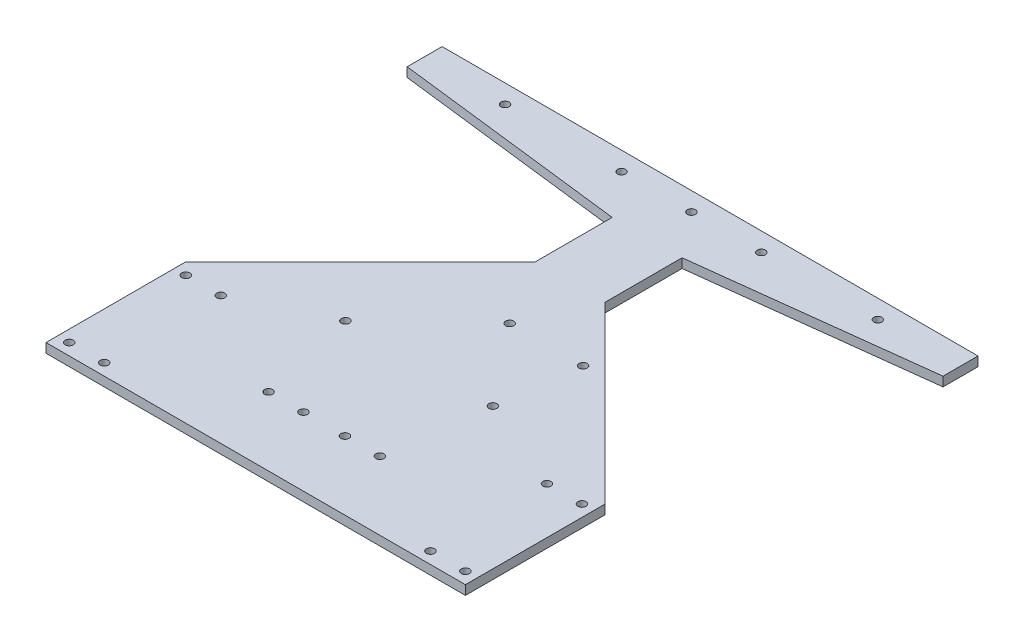
ISO-10303-21;
HEADER;
FILE_DESCRIPTION(('STEP AP214'),'2;1');
FILE_NAME('part.step','',(''),(''),'','','');
FILE_SCHEMA(('AUTOMOTIVE_DESIGN { 1 0 10303 214 1 1 1 1 }'));
ENDSEC;
DATA;
#1=APPLICATION_CONTEXT('core data for automotive mechanical design processes');
#2=APPLICATION_PROTOCOL_DEFINITION('international standard','automotive_design',2000,#1);
#3=PRODUCT_CONTEXT('',#1,'mechanical');
#4=PRODUCT('Part','Part','',(#3));
#5=PRODUCT_RELATED_PRODUCT_CATEGORY('part','',(#4));
#6=PRODUCT_DEFINITION_FORMATION('','',#4);
#7=PRODUCT_DEFINITION_CONTEXT('part definition',#1,'design');
#8=PRODUCT_DEFINITION('design','',#6,#7);
#9=PRODUCT_DEFINITION_SHAPE('','',#8);
#10=(LENGTH_UNIT() NAMED_UNIT(*) SI_UNIT(.MILLI.,.METRE.));
#11=(NAMED_UNIT(*) PLANE_ANGLE_UNIT() SI_UNIT($,.RADIAN.));
#12=(NAMED_UNIT(*) SI_UNIT($,.STERADIAN.) SOLID_ANGLE_UNIT());
#13=UNCERTAINTY_MEASURE_WITH_UNIT(LENGTH_MEASURE(1.E-05),#10,'distance_accuracy_value','');
#14=(GEOMETRIC_REPRESENTATION_CONTEXT(3) GLOBAL_UNCERTAINTY_ASSIGNED_CONTEXT((#13)) GLOBAL_UNIT_ASSIGNED_CONTEXT((#10,
#11,#12)) REPRESENTATION_CONTEXT('',''));
#15=CARTESIAN_POINT('',(0.,0.,0.));
#16=DIRECTION('',(0.,0.,1.));
#17=DIRECTION('',(1.,0.,0.));
#18=AXIS2_PLACEMENT_3D('',#15,#16,#17);
#19=CARTESIAN_POINT('',(90.,4.,-30.));
#20=DIRECTION('',(-1.,0.,0.));
#21=DIRECTION('',(0.,0.,1.));
#22=AXIS2_PLACEMENT_3D('',#19,#20,#21);
#23=PLANE('',#22);
#24=DIRECTION('',(0.,0.,-1.));
#25=VECTOR('',#24,1.);
#26=CARTESIAN_POINT('',(90.,0.,-30.));
#27=LINE('',#26,#25);
#28=CARTESIAN_POINT('',(90.,0.,30.));
#29=VERTEX_POINT('',#28);
#30=CARTESIAN_POINT('',(90.,0.,-30.));
#31=VERTEX_POINT('',#30);
#32=EDGE_CURVE('E167',#29,#31,#27,.T.);
#33=ORIENTED_EDGE('',*,*,#32,.T.);
#34=DIRECTION('',(0.,-1.,0.));
#35=VECTOR('',#34,1.);
#36=CARTESIAN_POINT('',(90.,4.,-30.));
#37=LINE('',#36,#35);
#38=CARTESIAN_POINT('',(90.,4.,-30.));
#39=VERTEX_POINT('',#38);
#40=EDGE_CURVE('E11',#39,#31,#37,.T.);
#41=ORIENTED_EDGE('',*,*,#40,.F.);
#42=DIRECTION('',(0.,0.,-1.));
#43=VECTOR('',#42,1.);
#44=CARTESIAN_POINT('',(90.,4.,-30.));
#45=LINE('',#44,#43);
#46=CARTESIAN_POINT('',(90.,4.,30.));
#47=VERTEX_POINT('',#46);
#48=EDGE_CURVE('E202',#47,#39,#45,.T.);
#49=ORIENTED_EDGE('',*,*,#48,.F.);
#50=DIRECTION('',(0.,-1.,0.));
#51=VECTOR('',#50,1.);
#52=CARTESIAN_POINT('',(90.,4.,30.));
#53=LINE('',#52,#51);
#54=EDGE_CURVE('E163',#47,#29,#53,.T.);
#55=ORIENTED_EDGE('',*,*,#54,.T.);
#56=EDGE_LOOP('',(#33,#41,#49,#55));
#57=FACE_BOUND('',#56,.T.);
#58=ADVANCED_FACE('F42',(#57),#23,.F.);
#59=CARTESIAN_POINT('',(90.,4.,-30.));
#60=DIRECTION('',(-0.707106781186548,0.,0.707106781186547));
#61=DIRECTION('',(0.707106781186547,0.,0.707106781186548));
#62=AXIS2_PLACEMENT_3D('',#59,#60,#61);
#63=PLANE('',#62);
#64=DIRECTION('',(-0.707106781186547,0.,-0.707106781186548));
#65=VECTOR('',#64,1.);
#66=CARTESIAN_POINT('',(90.,0.,-30.));
#67=LINE('',#66,#65);
#68=CARTESIAN_POINT('',(15.,0.,-105.));
#69=VERTEX_POINT('',#68);
#70=EDGE_CURVE('E171',#31,#69,#67,.T.);
#71=ORIENTED_EDGE('',*,*,#70,.T.);
#72=DIRECTION('',(0.,-1.,0.));
#73=VECTOR('',#72,1.);
#74=CARTESIAN_POINT('',(15.,4.,-105.));
#75=LINE('',#74,#73);
#76=CARTESIAN_POINT('',(15.,4.,-105.));
#77=VERTEX_POINT('',#76);
#78=EDGE_CURVE('E51',#77,#69,#75,.T.);
#79=ORIENTED_EDGE('',*,*,#78,.F.);
#80=DIRECTION('',(-0.707106781186547,0.,-0.707106781186548));
#81=VECTOR('',#80,1.);
#82=CARTESIAN_POINT('',(90.,4.,-30.));
#83=LINE('',#82,#81);
#84=EDGE_CURVE('E114',#39,#77,#83,.T.);
#85=ORIENTED_EDGE('',*,*,#84,.F.);
#86=ORIENTED_EDGE('',*,*,#40,.T.);
#87=EDGE_LOOP('',(#71,#79,#85,#86));
#88=FACE_BOUND('',#87,.T.);
#89=ADVANCED_FACE('F298',(#88),#63,.F.);
#90=CARTESIAN_POINT('',(15.,4.,-105.));
#91=DIRECTION('',(-1.,0.,0.));
#92=DIRECTION('',(0.,0.,1.));
#93=AXIS2_PLACEMENT_3D('',#90,#91,#92);
#94=PLANE('',#93);
#95=DIRECTION('',(0.,0.,-1.));
#96=VECTOR('',#95,1.);
#97=CARTESIAN_POINT('',(15.,0.,-105.));
#98=LINE('',#97,#96);
#99=CARTESIAN_POINT('',(15.,0.,-138.));
#100=VERTEX_POINT('',#99);
#101=EDGE_CURVE('E175',#69,#100,#98,.T.);
#102=ORIENTED_EDGE('',*,*,#101,.T.);
#103=DIRECTION('',(0.,-1.,0.));
#104=VECTOR('',#103,1.);
#105=CARTESIAN_POINT('',(15.,4.,-138.));
#106=LINE('',#105,#104);
#107=CARTESIAN_POINT('',(15.,4.,-138.));
#108=VERTEX_POINT('',#107);
#109=EDGE_CURVE('E229',#108,#100,#106,.T.);
#110=ORIENTED_EDGE('',*,*,#109,.F.);
#111=DIRECTION('',(0.,0.,-1.));
#112=VECTOR('',#111,1.);
#113=CARTESIAN_POINT('',(15.,4.,-105.));
#114=LINE('',#113,#112);
#115=EDGE_CURVE('E239',#77,#108,#114,.T.);
#116=ORIENTED_EDGE('',*,*,#115,.F.);
#117=ORIENTED_EDGE('',*,*,#78,.T.);
#118=EDGE_LOOP('',(#102,#110,#116,#117));
#119=FACE_BOUND('',#118,.T.);
#120=ADVANCED_FACE('F237',(#119),#94,.F.);
#121=CARTESIAN_POINT('',(15.,4.,-138.));
#122=DIRECTION('',(-0.11914522061843,0.,-0.992876838486922));
#123=DIRECTION('',(-0.992876838486922,0.,0.11914522061843));
#124=AXIS2_PLACEMENT_3D('',#121,#122,#123);
#125=PLANE('',#124);
#126=DIRECTION('',(0.992876838486922,0.,-0.11914522061843));
#127=VECTOR('',#126,1.);
#128=CARTESIAN_POINT('',(15.,0.,-138.));
#129=LINE('',#128,#127);
#130=CARTESIAN_POINT('',(115.,0.,-150.));
#131=VERTEX_POINT('',#130);
#132=EDGE_CURVE('E178',#100,#131,#129,.T.);
#133=ORIENTED_EDGE('',*,*,#132,.T.);
#134=DIRECTION('',(0.,-1.,0.));
#135=VECTOR('',#134,1.);
#136=CARTESIAN_POINT('',(115.,4.,-150.));
#137=LINE('',#136,#135);
#138=CARTESIAN_POINT('',(115.,4.,-150.));
#139=VERTEX_POINT('',#138);
#140=EDGE_CURVE('E225',#139,#131,#137,.T.);
#141=ORIENTED_EDGE('',*,*,#140,.F.);
#142=DIRECTION('',(0.992876838486922,0.,-0.11914522061843));
#143=VECTOR('',#142,1.);
#144=CARTESIAN_POINT('',(15.,4.,-138.));
#145=LINE('',#144,#143);
#146=EDGE_CURVE('E258',#108,#139,#145,.T.);
#147=ORIENTED_EDGE('',*,*,#146,.F.);
#148=ORIENTED_EDGE('',*,*,#109,.T.);
#149=EDGE_LOOP('',(#133,#141,#147,#148));
#150=FACE_BOUND('',#149,.T.);
#151=ADVANCED_FACE('F248',(#150),#125,.F.);
#152=CARTESIAN_POINT('',(115.,4.,-150.));
#153=DIRECTION('',(-1.,0.,0.));
#154=DIRECTION('',(0.,0.,1.));
#155=AXIS2_PLACEMENT_3D('',#152,#153,#154);
#156=PLANE('',#155);
#157=DIRECTION('',(0.,0.,-1.));
#158=VECTOR('',#157,1.);
#159=CARTESIAN_POINT('',(115.,0.,-150.));
#160=LINE('',#159,#158);
#161=CARTESIAN_POINT('',(115.,0.,-165.));
#162=VERTEX_POINT('',#161);
#163=EDGE_CURVE('E181',#131,#162,#160,.T.);
#164=ORIENTED_EDGE('',*,*,#163,.T.);
#165=DIRECTION('',(0.,-1.,0.));
#166=VECTOR('',#165,1.);
#167=CARTESIAN_POINT('',(115.,4.,-165.));
#168=LINE('',#167,#166);
#169=CARTESIAN_POINT('',(115.,4.,-165.));
#170=VERTEX_POINT('',#169);
#171=EDGE_CURVE('E221',#170,#162,#168,.T.);
#172=ORIENTED_EDGE('',*,*,#171,.F.);
#173=DIRECTION('',(0.,0.,-1.));
#174=VECTOR('',#173,1.);
#175=CARTESIAN_POINT('',(115.,4.,-150.));
#176=LINE('',#175,#174);
#177=EDGE_CURVE('E254',#139,#170,#176,.T.);
#178=ORIENTED_EDGE('',*,*,#177,.F.);
#179=ORIENTED_EDGE('',*,*,#140,.T.);
#180=EDGE_LOOP('',(#164,#172,#178,#179));
#181=FACE_BOUND('',#180,.T.);
#182=ADVANCED_FACE('F252',(#181),#156,.F.);
#183=CARTESIAN_POINT('',(115.,4.,-165.));
#184=DIRECTION('',(0.,0.,1.));
#185=DIRECTION('',(1.,0.,0.));
#186=AXIS2_PLACEMENT_3D('',#183,#184,#185);
#187=PLANE('',#186);
#188=DIRECTION('',(-1.,0.,0.));
#189=VECTOR('',#188,1.);
#190=CARTESIAN_POINT('',(115.,0.,-165.));
#191=LINE('',#190,#189);
#192=CARTESIAN_POINT('',(-115.,0.,-165.));
#193=VERTEX_POINT('',#192);
#194=EDGE_CURVE('E184',#162,#193,#191,.T.);
#195=ORIENTED_EDGE('',*,*,#194,.T.);
#196=DIRECTION('',(0.,-1.,0.));
#197=VECTOR('',#196,1.);
#198=CARTESIAN_POINT('',(-115.,4.,-165.));
#199=LINE('',#198,#197);
#200=CARTESIAN_POINT('',(-115.,4.,-165.));
#201=VERTEX_POINT('',#200);
#202=EDGE_CURVE('E217',#201,#193,#199,.T.);
#203=ORIENTED_EDGE('',*,*,#202,.F.);
#204=DIRECTION('',(-1.,0.,0.));
#205=VECTOR('',#204,1.);
#206=CARTESIAN_POINT('',(115.,4.,-165.));
#207=LINE('',#206,#205);
#208=EDGE_CURVE('E257',#170,#201,#207,.T.);
#209=ORIENTED_EDGE('',*,*,#208,.F.);
#210=ORIENTED_EDGE('',*,*,#171,.T.);
#211=EDGE_LOOP('',(#195,#203,#209,#210));
#212=FACE_BOUND('',#211,.T.);
#213=ADVANCED_FACE('F311',(#212),#187,.F.);
#214=CARTESIAN_POINT('',(-115.,4.,-165.));
#215=DIRECTION('',(1.,0.,0.));
#216=DIRECTION('',(0.,0.,-1.));
#217=AXIS2_PLACEMENT_3D('',#214,#215,#216);
#218=PLANE('',#217);
#219=DIRECTION('',(0.,0.,1.));
#220=VECTOR('',#219,1.);
#221=CARTESIAN_POINT('',(-115.,0.,-165.));
#222=LINE('',#221,#220);
#223=CARTESIAN_POINT('',(-115.,0.,-150.));
#224=VERTEX_POINT('',#223);
#225=EDGE_CURVE('E187',#193,#224,#222,.T.);
#226=ORIENTED_EDGE('',*,*,#225,.T.);
#227=DIRECTION('',(0.,-1.,0.));
#228=VECTOR('',#227,1.);
#229=CARTESIAN_POINT('',(-115.,4.,-150.));
#230=LINE('',#229,#228);
#231=CARTESIAN_POINT('',(-115.,4.,-150.));
#232=VERTEX_POINT('',#231);
#233=EDGE_CURVE('E213',#232,#224,#230,.T.);
#234=ORIENTED_EDGE('',*,*,#233,.F.);
#235=DIRECTION('',(0.,0.,1.));
#236=VECTOR('',#235,1.);
#237=CARTESIAN_POINT('',(-115.,4.,-165.));
#238=LINE('',#237,#236);
#239=EDGE_CURVE('E262',#201,#232,#238,.T.);
#240=ORIENTED_EDGE('',*,*,#239,.F.);
#241=ORIENTED_EDGE('',*,*,#202,.T.);
#242=EDGE_LOOP('',(#226,#234,#240,#241));
#243=FACE_BOUND('',#242,.T.);
#244=ADVANCED_FACE('F314',(#243),#218,.F.);
#245=CARTESIAN_POINT('',(-115.,4.,-150.));
#246=DIRECTION('',(0.11914522061843,0.,-0.992876838486922));
#247=DIRECTION('',(-0.992876838486922,0.,-0.11914522061843));
#248=AXIS2_PLACEMENT_3D('',#245,#246,#247);
#249=PLANE('',#248);
#250=DIRECTION('',(0.992876838486922,0.,0.11914522061843));
#251=VECTOR('',#250,1.);
#252=CARTESIAN_POINT('',(-115.,0.,-150.));
#253=LINE('',#252,#251);
#254=CARTESIAN_POINT('',(-15.,0.,-138.));
#255=VERTEX_POINT('',#254);
#256=EDGE_CURVE('E190',#224,#255,#253,.T.);
#257=ORIENTED_EDGE('',*,*,#256,.T.);
#258=DIRECTION('',(0.,-1.,0.));
#259=VECTOR('',#258,1.);
#260=CARTESIAN_POINT('',(-15.,4.,-138.));
#261=LINE('',#260,#259);
#262=CARTESIAN_POINT('',(-15.,4.,-138.));
#263=VERTEX_POINT('',#262);
#264=EDGE_CURVE('E209',#263,#255,#261,.T.);
#265=ORIENTED_EDGE('',*,*,#264,.F.);
#266=DIRECTION('',(0.992876838486922,0.,0.11914522061843));
#267=VECTOR('',#266,1.);
#268=CARTESIAN_POINT('',(-115.,4.,-150.));
#269=LINE('',#268,#267);
#270=EDGE_CURVE('E269',#232,#263,#269,.T.);
#271=ORIENTED_EDGE('',*,*,#270,.F.);
#272=ORIENTED_EDGE('',*,*,#233,.T.);
#273=EDGE_LOOP('',(#257,#265,#271,#272));
#274=FACE_BOUND('',#273,.T.);
#275=ADVANCED_FACE('F277',(#274),#249,.F.);
#276=CARTESIAN_POINT('',(-15.,4.,-138.));
#277=DIRECTION('',(1.,0.,0.));
#278=DIRECTION('',(0.,0.,-1.));
#279=AXIS2_PLACEMENT_3D('',#276,#277,#278);
#280=PLANE('',#279);
#281=DIRECTION('',(0.,0.,1.));
#282=VECTOR('',#281,1.);
#283=CARTESIAN_POINT('',(-15.,0.,-138.));
#284=LINE('',#283,#282);
#285=CARTESIAN_POINT('',(-15.,0.,-105.));
#286=VERTEX_POINT('',#285);
#287=EDGE_CURVE('E193',#255,#286,#284,.T.);
#288=ORIENTED_EDGE('',*,*,#287,.T.);
#289=DIRECTION('',(0.,-1.,0.));
#290=VECTOR('',#289,1.);
#291=CARTESIAN_POINT('',(-15.,4.,-105.));
#292=LINE('',#291,#290);
#293=CARTESIAN_POINT('',(-15.,4.,-105.));
#294=VERTEX_POINT('',#293);
#295=EDGE_CURVE('E156',#294,#286,#292,.T.);
#296=ORIENTED_EDGE('',*,*,#295,.F.);
#297=DIRECTION('',(0.,0.,1.));
#298=VECTOR('',#297,1.);
#299=CARTESIAN_POINT('',(-15.,4.,-138.));
#300=LINE('',#299,#298);
#301=EDGE_CURVE('E145',#263,#294,#300,.T.);
#302=ORIENTED_EDGE('',*,*,#301,.F.);
#303=ORIENTED_EDGE('',*,*,#264,.T.);
#304=EDGE_LOOP('',(#288,#296,#302,#303));
#305=FACE_BOUND('',#304,.T.);
#306=ADVANCED_FACE('F281',(#305),#280,.F.);
#307=CARTESIAN_POINT('',(-90.,4.,-30.));
#308=DIRECTION('',(0.707106781186548,0.,0.707106781186547));
#309=DIRECTION('',(0.707106781186547,0.,-0.707106781186548));
#310=AXIS2_PLACEMENT_3D('',#307,#308,#309);
#311=PLANE('',#310);
#312=DIRECTION('',(-0.707106781186547,0.,0.707106781186548));
#313=VECTOR('',#312,1.);
#314=CARTESIAN_POINT('',(-90.,0.,-30.));
#315=LINE('',#314,#313);
#316=CARTESIAN_POINT('',(-90.,0.,-30.));
#317=VERTEX_POINT('',#316);
#318=EDGE_CURVE('E154',#286,#317,#315,.T.);
#319=ORIENTED_EDGE('',*,*,#318,.T.);
#320=DIRECTION('',(0.,-1.,0.));
#321=VECTOR('',#320,1.);
#322=CARTESIAN_POINT('',(-90.,4.,-30.));
#323=LINE('',#322,#321);
#324=CARTESIAN_POINT('',(-90.,4.,-30.));
#325=VERTEX_POINT('',#324);
#326=EDGE_CURVE('E151',#325,#317,#323,.T.);
#327=ORIENTED_EDGE('',*,*,#326,.F.);
#328=DIRECTION('',(-0.707106781186547,0.,0.707106781186548));
#329=VECTOR('',#328,1.);
#330=CARTESIAN_POINT('',(-90.,4.,-30.));
#331=LINE('',#330,#329);
#332=EDGE_CURVE('E139',#294,#325,#331,.T.);
#333=ORIENTED_EDGE('',*,*,#332,.F.);
#334=ORIENTED_EDGE('',*,*,#295,.T.);
#335=EDGE_LOOP('',(#319,#327,#333,#334));
#336=FACE_BOUND('',#335,.T.);
#337=ADVANCED_FACE('F152',(#336),#311,.F.);
#338=CARTESIAN_POINT('',(-90.,4.,-30.));
#339=DIRECTION('',(1.,0.,0.));
#340=DIRECTION('',(0.,0.,-1.));
#341=AXIS2_PLACEMENT_3D('',#338,#339,#340);
#342=PLANE('',#341);
#343=DIRECTION('',(0.,0.,1.));
#344=VECTOR('',#343,1.);
#345=CARTESIAN_POINT('',(-90.,0.,-30.));
#346=LINE('',#345,#344);
#347=CARTESIAN_POINT('',(-90.,0.,30.));
#348=VERTEX_POINT('',#347);
#349=EDGE_CURVE('E100',#317,#348,#346,.T.);
#350=ORIENTED_EDGE('',*,*,#349,.T.);
#351=DIRECTION('',(0.,-1.,0.));
#352=VECTOR('',#351,1.);
#353=CARTESIAN_POINT('',(-90.,4.,30.));
#354=LINE('',#353,#352);
#355=CARTESIAN_POINT('',(-90.,4.,30.));
#356=VERTEX_POINT('',#355);
#357=EDGE_CURVE('E157',#356,#348,#354,.T.);
#358=ORIENTED_EDGE('',*,*,#357,.F.);
#359=DIRECTION('',(0.,0.,1.));
#360=VECTOR('',#359,1.);
#361=CARTESIAN_POINT('',(-90.,4.,-30.));
#362=LINE('',#361,#360);
#363=EDGE_CURVE('E143',#325,#356,#362,.T.);
#364=ORIENTED_EDGE('',*,*,#363,.F.);
#365=ORIENTED_EDGE('',*,*,#326,.T.);
#366=EDGE_LOOP('',(#350,#358,#364,#365));
#367=FACE_BOUND('',#366,.T.);
#368=ADVANCED_FACE('F159',(#367),#342,.F.);
#369=CARTESIAN_POINT('',(-90.,4.,30.));
#370=DIRECTION('',(0.,0.,-1.));
#371=DIRECTION('',(-1.,0.,0.));
#372=AXIS2_PLACEMENT_3D('',#369,#370,#371);
#373=PLANE('',#372);
#374=DIRECTION('',(1.,0.,0.));
#375=VECTOR('',#374,1.);
#376=CARTESIAN_POINT('',(-90.,0.,30.));
#377=LINE('',#376,#375);
#378=EDGE_CURVE('E106',#348,#29,#377,.T.);
#379=ORIENTED_EDGE('',*,*,#378,.T.);
#380=ORIENTED_EDGE('',*,*,#54,.F.);
#381=DIRECTION('',(1.,0.,0.));
#382=VECTOR('',#381,1.);
#383=CARTESIAN_POINT('',(-90.,4.,30.));
#384=LINE('',#383,#382);
#385=EDGE_CURVE('E59',#356,#47,#384,.T.);
#386=ORIENTED_EDGE('',*,*,#385,.F.);
#387=ORIENTED_EDGE('',*,*,#357,.T.);
#388=EDGE_LOOP('',(#379,#380,#386,#387));
#389=FACE_BOUND('',#388,.T.);
#390=ADVANCED_FACE('F285',(#389),#373,.F.);
#391=CARTESIAN_POINT('',(0.,4.,0.));
#392=DIRECTION('',(0.,1.,0.));
#393=DIRECTION('',(0.,0.,1.));
#394=AXIS2_PLACEMENT_3D('',#391,#392,#393);
#395=PLANE('',#394);
#396=CARTESIAN_POINT('',(-30.,4.,-157.));
#397=DIRECTION('',(0.,1.,0.));
#398=DIRECTION('',(0.,0.,1.));
#399=AXIS2_PLACEMENT_3D('',#396,#397,#398);
#400=CIRCLE('',#399,1.75);
#401=CARTESIAN_POINT('',(-30.,4.,-155.25));
#402=VERTEX_POINT('',#401);
#403=EDGE_CURVE('E689',#402,#402,#400,.T.);
#404=ORIENTED_EDGE('',*,*,#403,.F.);
#405=EDGE_LOOP('',(#404));
#406=FACE_BOUND('',#405,.T.);
#407=CARTESIAN_POINT('',(30.,4.,-157.));
#408=DIRECTION('',(0.,1.,0.));
#409=DIRECTION('',(0.,0.,1.));
#410=AXIS2_PLACEMENT_3D('',#407,#408,#409);
#411=CIRCLE('',#410,1.75);
#412=CARTESIAN_POINT('',(30.,4.,-155.25));
#413=VERTEX_POINT('',#412);
#414=EDGE_CURVE('E698',#413,#413,#411,.T.);
#415=ORIENTED_EDGE('',*,*,#414,.F.);
#416=EDGE_LOOP('',(#415));
#417=FACE_BOUND('',#416,.T.);
#418=CARTESIAN_POINT('',(80.,4.,-157.));
#419=DIRECTION('',(0.,1.,0.));
#420=DIRECTION('',(0.,0.,1.));
#421=AXIS2_PLACEMENT_3D('',#418,#419,#420);
#422=CIRCLE('',#421,1.75);
#423=CARTESIAN_POINT('',(80.,4.,-155.25));
#424=VERTEX_POINT('',#423);
#425=EDGE_CURVE('E711',#424,#424,#422,.T.);
#426=ORIENTED_EDGE('',*,*,#425,.F.);
#427=EDGE_LOOP('',(#426));
#428=FACE_BOUND('',#427,.T.);
#429=CARTESIAN_POINT('',(-80.,4.,-157.));
#430=DIRECTION('',(0.,1.,0.));
#431=DIRECTION('',(0.,0.,1.));
#432=AXIS2_PLACEMENT_3D('',#429,#430,#431);
#433=CIRCLE('',#432,1.75);
#434=CARTESIAN_POINT('',(-80.,4.,-155.25));
#435=VERTEX_POINT('',#434);
#436=EDGE_CURVE('E941',#435,#435,#433,.T.);
#437=ORIENTED_EDGE('',*,*,#436,.F.);
#438=EDGE_LOOP('',(#437));
#439=FACE_BOUND('',#438,.T.);
#440=CARTESIAN_POINT('',(0.,4.,-157.));
#441=DIRECTION('',(0.,1.,0.));
#442=DIRECTION('',(0.,0.,1.));
#443=AXIS2_PLACEMENT_3D('',#440,#441,#442);
#444=CIRCLE('',#443,1.75);
#445=CARTESIAN_POINT('',(0.,4.,-155.25));
#446=VERTEX_POINT('',#445);
#447=EDGE_CURVE('E691',#446,#446,#444,.T.);
#448=ORIENTED_EDGE('',*,*,#447,.F.);
#449=EDGE_LOOP('',(#448));
#450=FACE_BOUND('',#449,.T.);
#451=CARTESIAN_POINT('',(-23.9,4.,0.599999999999996));
#452=DIRECTION('',(0.,1.,0.));
#453=DIRECTION('',(0.,0.,1.));
#454=AXIS2_PLACEMENT_3D('',#451,#452,#453);
#455=CIRCLE('',#454,1.75);
#456=CARTESIAN_POINT('',(-23.9,4.,2.35));
#457=VERTEX_POINT('',#456);
#458=EDGE_CURVE('E721',#457,#457,#455,.T.);
#459=ORIENTED_EDGE('',*,*,#458,.F.);
#460=EDGE_LOOP('',(#459));
#461=FACE_BOUND('',#460,.T.);
#462=CARTESIAN_POINT('',(-8.9,4.,0.599999999999996));
#463=DIRECTION('',(0.,1.,0.));
#464=DIRECTION('',(0.,0.,1.));
#465=AXIS2_PLACEMENT_3D('',#462,#463,#464);
#466=CIRCLE('',#465,1.75);
#467=CARTESIAN_POINT('',(-8.9,4.,2.35));
#468=VERTEX_POINT('',#467);
#469=EDGE_CURVE('E725',#468,#468,#466,.T.);
#470=ORIENTED_EDGE('',*,*,#469,.F.);
#471=EDGE_LOOP('',(#470));
#472=FACE_BOUND('',#471,.T.);
#473=CARTESIAN_POINT('',(8.9,4.,0.599999999999996));
#474=DIRECTION('',(0.,1.,0.));
#475=DIRECTION('',(0.,0.,1.));
#476=AXIS2_PLACEMENT_3D('',#473,#474,#475);
#477=CIRCLE('',#476,1.75);
#478=CARTESIAN_POINT('',(8.9,4.,2.35));
#479=VERTEX_POINT('',#478);
#480=EDGE_CURVE('E733',#479,#479,#477,.T.);
#481=ORIENTED_EDGE('',*,*,#480,.F.);
#482=EDGE_LOOP('',(#481));
#483=FACE_BOUND('',#482,.T.);
#484=CARTESIAN_POINT('',(23.9,4.,0.599999999999996));
#485=DIRECTION('',(0.,1.,0.));
#486=DIRECTION('',(0.,0.,1.));
#487=AXIS2_PLACEMENT_3D('',#484,#485,#486);
#488=CIRCLE('',#487,1.75);
#489=CARTESIAN_POINT('',(23.9,4.,2.35));
#490=VERTEX_POINT('',#489);
#491=EDGE_CURVE('E741',#490,#490,#488,.T.);
#492=ORIENTED_EDGE('',*,*,#491,.F.);
#493=EDGE_LOOP('',(#492));
#494=FACE_BOUND('',#493,.T.);
#495=CARTESIAN_POINT('',(-33.8,4.,-42.3));
#496=DIRECTION('',(0.,1.,0.));
#497=DIRECTION('',(0.,0.,1.));
#498=AXIS2_PLACEMENT_3D('',#495,#496,#497);
#499=CIRCLE('',#498,1.75);
#500=CARTESIAN_POINT('',(-33.8,4.,-40.55));
#501=VERTEX_POINT('',#500);
#502=EDGE_CURVE('E756',#501,#501,#499,.T.);
#503=ORIENTED_EDGE('',*,*,#502,.F.);
#504=EDGE_LOOP('',(#503));
#505=FACE_BOUND('',#504,.T.);
#506=CARTESIAN_POINT('',(33.9,4.,-76.6));
#507=DIRECTION('',(0.,1.,0.));
#508=DIRECTION('',(0.,0.,1.));
#509=AXIS2_PLACEMENT_3D('',#506,#507,#508);
#510=CIRCLE('',#509,1.75);
#511=CARTESIAN_POINT('',(33.9,4.,-74.85));
#512=VERTEX_POINT('',#511);
#513=EDGE_CURVE('E765',#512,#512,#510,.T.);
#514=ORIENTED_EDGE('',*,*,#513,.F.);
#515=EDGE_LOOP('',(#514));
#516=FACE_BOUND('',#515,.T.);
#517=CARTESIAN_POINT('',(29.5,4.,-42.3));
#518=DIRECTION('',(0.,1.,0.));
#519=DIRECTION('',(0.,0.,1.));
#520=AXIS2_PLACEMENT_3D('',#517,#518,#519);
#521=CIRCLE('',#520,1.75);
#522=CARTESIAN_POINT('',(29.5,4.,-40.55));
#523=VERTEX_POINT('',#522);
#524=EDGE_CURVE('E748',#523,#523,#521,.T.);
#525=ORIENTED_EDGE('',*,*,#524,.F.);
#526=EDGE_LOOP('',(#525));
#527=FACE_BOUND('',#526,.T.);
#528=CARTESIAN_POINT('',(2.4,4.,-76.6));
#529=DIRECTION('',(0.,1.,0.));
#530=DIRECTION('',(0.,0.,1.));
#531=AXIS2_PLACEMENT_3D('',#528,#529,#530);
#532=CIRCLE('',#531,1.75);
#533=CARTESIAN_POINT('',(2.4,4.,-74.85));
#534=VERTEX_POINT('',#533);
#535=EDGE_CURVE('E760',#534,#534,#532,.T.);
#536=ORIENTED_EDGE('',*,*,#535,.F.);
#537=EDGE_LOOP('',(#536));
#538=FACE_BOUND('',#537,.T.);
#539=CARTESIAN_POINT('',(-70.,4.,-25.));
#540=DIRECTION('',(0.,1.,0.));
#541=DIRECTION('',(0.,0.,1.));
#542=AXIS2_PLACEMENT_3D('',#539,#540,#541);
#543=CIRCLE('',#542,1.75);
#544=CARTESIAN_POINT('',(-70.,4.,-23.25));
#545=VERTEX_POINT('',#544);
#546=EDGE_CURVE('E813',#545,#545,#543,.T.);
#547=ORIENTED_EDGE('',*,*,#546,.F.);
#548=EDGE_LOOP('',(#547));
#549=FACE_BOUND('',#548,.T.);
#550=CARTESIAN_POINT('',(-85.,4.,25.));
#551=DIRECTION('',(0.,1.,0.));
#552=DIRECTION('',(0.,0.,-1.));
#553=AXIS2_PLACEMENT_3D('',#550,#551,#552);
#554=CIRCLE('',#553,1.75);
#555=CARTESIAN_POINT('',(-85.,4.,23.25));
#556=VERTEX_POINT('',#555);
#557=EDGE_CURVE('E804',#556,#556,#554,.T.);
#558=ORIENTED_EDGE('',*,*,#557,.F.);
#559=EDGE_LOOP('',(#558));
#560=FACE_BOUND('',#559,.T.);
#561=CARTESIAN_POINT('',(-85.,4.,-25.));
#562=DIRECTION('',(0.,1.,0.));
#563=DIRECTION('',(0.,0.,1.));
#564=AXIS2_PLACEMENT_3D('',#561,#562,#563);
#565=CIRCLE('',#564,1.75);
#566=CARTESIAN_POINT('',(-85.,4.,-23.25));
#567=VERTEX_POINT('',#566);
#568=EDGE_CURVE('E829',#567,#567,#565,.T.);
#569=ORIENTED_EDGE('',*,*,#568,.F.);
#570=EDGE_LOOP('',(#569));
#571=FACE_BOUND('',#570,.T.);
#572=CARTESIAN_POINT('',(85.,4.,25.));
#573=DIRECTION('',(0.,1.,0.));
#574=DIRECTION('',(0.,0.,1.));
#575=AXIS2_PLACEMENT_3D('',#572,#573,#574);
#576=CIRCLE('',#575,1.75);
#577=CARTESIAN_POINT('',(85.,4.,26.75));
#578=VERTEX_POINT('',#577);
#579=EDGE_CURVE('E820',#578,#578,#576,.T.);
#580=ORIENTED_EDGE('',*,*,#579,.F.);
#581=EDGE_LOOP('',(#580));
#582=FACE_BOUND('',#581,.T.);
#583=CARTESIAN_POINT('',(-70.,4.,25.));
#584=DIRECTION('',(0.,1.,0.));
#585=DIRECTION('',(0.,0.,-1.));
#586=AXIS2_PLACEMENT_3D('',#583,#584,#585);
#587=CIRCLE('',#586,1.75);
#588=CARTESIAN_POINT('',(-70.,4.,23.25));
#589=VERTEX_POINT('',#588);
#590=EDGE_CURVE('E780',#589,#589,#587,.T.);
#591=ORIENTED_EDGE('',*,*,#590,.F.);
#592=EDGE_LOOP('',(#591));
#593=FACE_BOUND('',#592,.T.);
#594=CARTESIAN_POINT('',(70.,4.,25.));
#595=DIRECTION('',(0.,1.,0.));
#596=DIRECTION('',(0.,0.,1.));
#597=AXIS2_PLACEMENT_3D('',#594,#595,#596);
#598=CIRCLE('',#597,1.75);
#599=CARTESIAN_POINT('',(70.,4.,26.75));
#600=VERTEX_POINT('',#599);
#601=EDGE_CURVE('E789',#600,#600,#598,.T.);
#602=ORIENTED_EDGE('',*,*,#601,.F.);
#603=EDGE_LOOP('',(#602));
#604=FACE_BOUND('',#603,.T.);
#605=CARTESIAN_POINT('',(70.,4.,-25.));
#606=DIRECTION('',(0.,1.,0.));
#607=DIRECTION('',(0.,0.,-1.));
#608=AXIS2_PLACEMENT_3D('',#605,#606,#607);
#609=CIRCLE('',#608,1.75);
#610=CARTESIAN_POINT('',(70.,4.,-26.75));
#611=VERTEX_POINT('',#610);
#612=EDGE_CURVE('E797',#611,#611,#609,.T.);
#613=ORIENTED_EDGE('',*,*,#612,.F.);
#614=EDGE_LOOP('',(#613));
#615=FACE_BOUND('',#614,.T.);
#616=CARTESIAN_POINT('',(85.,4.,-25.));
#617=DIRECTION('',(0.,1.,0.));
#618=DIRECTION('',(0.,0.,-1.));
#619=AXIS2_PLACEMENT_3D('',#616,#617,#618);
#620=CIRCLE('',#619,1.75);
#621=CARTESIAN_POINT('',(85.,4.,-26.75));
#622=VERTEX_POINT('',#621);
#623=EDGE_CURVE('E824',#622,#622,#620,.T.);
#624=ORIENTED_EDGE('',*,*,#623,.F.);
#625=EDGE_LOOP('',(#624));
#626=FACE_BOUND('',#625,.T.);
#627=ORIENTED_EDGE('',*,*,#48,.T.);
#628=ORIENTED_EDGE('',*,*,#84,.T.);
#629=ORIENTED_EDGE('',*,*,#115,.T.);
#630=ORIENTED_EDGE('',*,*,#146,.T.);
#631=ORIENTED_EDGE('',*,*,#177,.T.);
#632=ORIENTED_EDGE('',*,*,#208,.T.);
#633=ORIENTED_EDGE('',*,*,#239,.T.);
#634=ORIENTED_EDGE('',*,*,#270,.T.);
#635=ORIENTED_EDGE('',*,*,#301,.T.);
#636=ORIENTED_EDGE('',*,*,#332,.T.);
#637=ORIENTED_EDGE('',*,*,#363,.T.);
#638=ORIENTED_EDGE('',*,*,#385,.T.);
#639=EDGE_LOOP('',(#627,#628,#629,#630,#631,#632,#633,#634,#635,#636,#637,#638));
#640=FACE_BOUND('',#639,.T.);
#641=ADVANCED_FACE('F141',(#406,#417,#428,#439,#450,#461,#472,#483,#494,#505,#516,#527,#538,
#549,#560,#571,#582,#593,#604,#615,#626,#640),#395,.T.);
#642=CARTESIAN_POINT('',(0.,0.,0.));
#643=DIRECTION('',(0.,1.,0.));
#644=DIRECTION('',(0.,0.,1.));
#645=AXIS2_PLACEMENT_3D('',#642,#643,#644);
#646=PLANE('',#645);
#647=CARTESIAN_POINT('',(-30.,0.,-157.));
#648=DIRECTION('',(0.,1.,0.));
#649=DIRECTION('',(0.,0.,1.));
#650=AXIS2_PLACEMENT_3D('',#647,#648,#649);
#651=CIRCLE('',#650,1.75);
#652=CARTESIAN_POINT('',(-30.,0.,-155.25));
#653=VERTEX_POINT('',#652);
#654=EDGE_CURVE('E686',#653,#653,#651,.T.);
#655=ORIENTED_EDGE('',*,*,#654,.T.);
#656=EDGE_LOOP('',(#655));
#657=FACE_BOUND('',#656,.T.);
#658=CARTESIAN_POINT('',(30.,0.,-157.));
#659=DIRECTION('',(0.,1.,0.));
#660=DIRECTION('',(0.,0.,1.));
#661=AXIS2_PLACEMENT_3D('',#658,#659,#660);
#662=CIRCLE('',#661,1.75);
#663=CARTESIAN_POINT('',(30.,0.,-155.25));
#664=VERTEX_POINT('',#663);
#665=EDGE_CURVE('E707',#664,#664,#662,.T.);
#666=ORIENTED_EDGE('',*,*,#665,.T.);
#667=EDGE_LOOP('',(#666));
#668=FACE_BOUND('',#667,.T.);
#669=CARTESIAN_POINT('',(80.,0.,-157.));
#670=DIRECTION('',(0.,1.,0.));
#671=DIRECTION('',(0.,0.,1.));
#672=AXIS2_PLACEMENT_3D('',#669,#670,#671);
#673=CIRCLE('',#672,1.75);
#674=CARTESIAN_POINT('',(80.,0.,-155.25));
#675=VERTEX_POINT('',#674);
#676=EDGE_CURVE('E935',#675,#675,#673,.T.);
#677=ORIENTED_EDGE('',*,*,#676,.T.);
#678=EDGE_LOOP('',(#677));
#679=FACE_BOUND('',#678,.T.);
#680=CARTESIAN_POINT('',(-80.,0.,-157.));
#681=DIRECTION('',(0.,1.,0.));
#682=DIRECTION('',(0.,0.,1.));
#683=AXIS2_PLACEMENT_3D('',#680,#681,#682);
#684=CIRCLE('',#683,1.75);
#685=CARTESIAN_POINT('',(-80.,0.,-155.25));
#686=VERTEX_POINT('',#685);
#687=EDGE_CURVE('E701',#686,#686,#684,.T.);
#688=ORIENTED_EDGE('',*,*,#687,.T.);
#689=EDGE_LOOP('',(#688));
#690=FACE_BOUND('',#689,.T.);
#691=CARTESIAN_POINT('',(0.,0.,-157.));
#692=DIRECTION('',(0.,1.,0.));
#693=DIRECTION('',(0.,0.,1.));
#694=AXIS2_PLACEMENT_3D('',#691,#692,#693);
#695=CIRCLE('',#694,1.75);
#696=CARTESIAN_POINT('',(0.,0.,-155.25));
#697=VERTEX_POINT('',#696);
#698=EDGE_CURVE('E696',#697,#697,#695,.T.);
#699=ORIENTED_EDGE('',*,*,#698,.T.);
#700=EDGE_LOOP('',(#699));
#701=FACE_BOUND('',#700,.T.);
#702=CARTESIAN_POINT('',(-23.9,0.,0.599999999999996));
#703=DIRECTION('',(0.,1.,0.));
#704=DIRECTION('',(0.,0.,1.));
#705=AXIS2_PLACEMENT_3D('',#702,#703,#704);
#706=CIRCLE('',#705,1.75);
#707=CARTESIAN_POINT('',(-23.9,0.,2.35));
#708=VERTEX_POINT('',#707);
#709=EDGE_CURVE('E716',#708,#708,#706,.T.);
#710=ORIENTED_EDGE('',*,*,#709,.T.);
#711=EDGE_LOOP('',(#710));
#712=FACE_BOUND('',#711,.T.);
#713=CARTESIAN_POINT('',(-8.9,0.,0.599999999999996));
#714=DIRECTION('',(0.,1.,0.));
#715=DIRECTION('',(0.,0.,1.));
#716=AXIS2_PLACEMENT_3D('',#713,#714,#715);
#717=CIRCLE('',#716,1.75);
#718=CARTESIAN_POINT('',(-8.9,0.,2.35));
#719=VERTEX_POINT('',#718);
#720=EDGE_CURVE('E729',#719,#719,#717,.T.);
#721=ORIENTED_EDGE('',*,*,#720,.T.);
#722=EDGE_LOOP('',(#721));
#723=FACE_BOUND('',#722,.T.);
#724=CARTESIAN_POINT('',(8.9,0.,0.599999999999996));
#725=DIRECTION('',(0.,1.,0.));
#726=DIRECTION('',(0.,0.,1.));
#727=AXIS2_PLACEMENT_3D('',#724,#725,#726);
#728=CIRCLE('',#727,1.75);
#729=CARTESIAN_POINT('',(8.9,0.,2.35));
#730=VERTEX_POINT('',#729);
#731=EDGE_CURVE('E737',#730,#730,#728,.T.);
#732=ORIENTED_EDGE('',*,*,#731,.T.);
#733=EDGE_LOOP('',(#732));
#734=FACE_BOUND('',#733,.T.);
#735=CARTESIAN_POINT('',(23.9,0.,0.599999999999996));
#736=DIRECTION('',(0.,1.,0.));
#737=DIRECTION('',(0.,0.,1.));
#738=AXIS2_PLACEMENT_3D('',#735,#736,#737);
#739=CIRCLE('',#738,1.75);
#740=CARTESIAN_POINT('',(23.9,0.,2.35));
#741=VERTEX_POINT('',#740);
#742=EDGE_CURVE('E714',#741,#741,#739,.T.);
#743=ORIENTED_EDGE('',*,*,#742,.T.);
#744=EDGE_LOOP('',(#743));
#745=FACE_BOUND('',#744,.T.);
#746=CARTESIAN_POINT('',(-33.8,0.,-42.3));
#747=DIRECTION('',(0.,1.,0.));
#748=DIRECTION('',(0.,0.,1.));
#749=AXIS2_PLACEMENT_3D('',#746,#747,#748);
#750=CIRCLE('',#749,1.75);
#751=CARTESIAN_POINT('',(-33.8,0.,-40.55));
#752=VERTEX_POINT('',#751);
#753=EDGE_CURVE('E761',#752,#752,#750,.T.);
#754=ORIENTED_EDGE('',*,*,#753,.T.);
#755=EDGE_LOOP('',(#754));
#756=FACE_BOUND('',#755,.T.);
#757=CARTESIAN_POINT('',(33.9,0.,-76.6));
#758=DIRECTION('',(0.,1.,0.));
#759=DIRECTION('',(0.,0.,1.));
#760=AXIS2_PLACEMENT_3D('',#757,#758,#759);
#761=CIRCLE('',#760,1.75);
#762=CARTESIAN_POINT('',(33.9,0.,-74.85));
#763=VERTEX_POINT('',#762);
#764=EDGE_CURVE('E752',#763,#763,#761,.T.);
#765=ORIENTED_EDGE('',*,*,#764,.T.);
#766=EDGE_LOOP('',(#765));
#767=FACE_BOUND('',#766,.T.);
#768=CARTESIAN_POINT('',(29.5,0.,-42.3));
#769=DIRECTION('',(0.,1.,0.));
#770=DIRECTION('',(0.,0.,1.));
#771=AXIS2_PLACEMENT_3D('',#768,#769,#770);
#772=CIRCLE('',#771,1.75);
#773=CARTESIAN_POINT('',(29.5,0.,-40.55));
#774=VERTEX_POINT('',#773);
#775=EDGE_CURVE('E720',#774,#774,#772,.T.);
#776=ORIENTED_EDGE('',*,*,#775,.T.);
#777=EDGE_LOOP('',(#776));
#778=FACE_BOUND('',#777,.T.);
#779=CARTESIAN_POINT('',(2.4,0.,-76.6));
#780=DIRECTION('',(0.,1.,0.));
#781=DIRECTION('',(0.,0.,1.));
#782=AXIS2_PLACEMENT_3D('',#779,#780,#781);
#783=CIRCLE('',#782,1.75);
#784=CARTESIAN_POINT('',(2.4,0.,-74.85));
#785=VERTEX_POINT('',#784);
#786=EDGE_CURVE('E772',#785,#785,#783,.T.);
#787=ORIENTED_EDGE('',*,*,#786,.T.);
#788=EDGE_LOOP('',(#787));
#789=FACE_BOUND('',#788,.T.);
#790=CARTESIAN_POINT('',(-70.,0.,-25.));
#791=DIRECTION('',(0.,1.,0.));
#792=DIRECTION('',(0.,0.,1.));
#793=AXIS2_PLACEMENT_3D('',#790,#791,#792);
#794=CIRCLE('',#793,1.75);
#795=CARTESIAN_POINT('',(-70.,0.,-23.25));
#796=VERTEX_POINT('',#795);
#797=EDGE_CURVE('E784',#796,#796,#794,.T.);
#798=ORIENTED_EDGE('',*,*,#797,.T.);
#799=EDGE_LOOP('',(#798));
#800=FACE_BOUND('',#799,.T.);
#801=CARTESIAN_POINT('',(-85.,0.,25.));
#802=DIRECTION('',(0.,1.,0.));
#803=DIRECTION('',(0.,0.,-1.));
#804=AXIS2_PLACEMENT_3D('',#801,#802,#803);
#805=CIRCLE('',#804,1.75);
#806=CARTESIAN_POINT('',(-85.,0.,23.25));
#807=VERTEX_POINT('',#806);
#808=EDGE_CURVE('E809',#807,#807,#805,.T.);
#809=ORIENTED_EDGE('',*,*,#808,.T.);
#810=EDGE_LOOP('',(#809));
#811=FACE_BOUND('',#810,.T.);
#812=CARTESIAN_POINT('',(-85.,0.,-25.));
#813=DIRECTION('',(0.,1.,0.));
#814=DIRECTION('',(0.,0.,1.));
#815=AXIS2_PLACEMENT_3D('',#812,#813,#814);
#816=CIRCLE('',#815,1.75);
#817=CARTESIAN_POINT('',(-85.,0.,-23.25));
#818=VERTEX_POINT('',#817);
#819=EDGE_CURVE('E808',#818,#818,#816,.T.);
#820=ORIENTED_EDGE('',*,*,#819,.T.);
#821=EDGE_LOOP('',(#820));
#822=FACE_BOUND('',#821,.T.);
#823=CARTESIAN_POINT('',(85.,0.,25.));
#824=DIRECTION('',(0.,1.,0.));
#825=DIRECTION('',(0.,0.,1.));
#826=AXIS2_PLACEMENT_3D('',#823,#824,#825);
#827=CIRCLE('',#826,1.75);
#828=CARTESIAN_POINT('',(85.,0.,26.75));
#829=VERTEX_POINT('',#828);
#830=EDGE_CURVE('E825',#829,#829,#827,.T.);
#831=ORIENTED_EDGE('',*,*,#830,.T.);
#832=EDGE_LOOP('',(#831));
#833=FACE_BOUND('',#832,.T.);
#834=CARTESIAN_POINT('',(-70.,0.,25.));
#835=DIRECTION('',(0.,1.,0.));
#836=DIRECTION('',(0.,0.,-1.));
#837=AXIS2_PLACEMENT_3D('',#834,#835,#836);
#838=CIRCLE('',#837,1.75);
#839=CARTESIAN_POINT('',(-70.,0.,23.25));
#840=VERTEX_POINT('',#839);
#841=EDGE_CURVE('E785',#840,#840,#838,.T.);
#842=ORIENTED_EDGE('',*,*,#841,.T.);
#843=EDGE_LOOP('',(#842));
#844=FACE_BOUND('',#843,.T.);
#845=CARTESIAN_POINT('',(70.,0.,25.));
#846=DIRECTION('',(0.,1.,0.));
#847=DIRECTION('',(0.,0.,1.));
#848=AXIS2_PLACEMENT_3D('',#845,#846,#847);
#849=CIRCLE('',#848,1.75);
#850=CARTESIAN_POINT('',(70.,0.,26.75));
#851=VERTEX_POINT('',#850);
#852=EDGE_CURVE('E793',#851,#851,#849,.T.);
#853=ORIENTED_EDGE('',*,*,#852,.T.);
#854=EDGE_LOOP('',(#853));
#855=FACE_BOUND('',#854,.T.);
#856=CARTESIAN_POINT('',(70.,0.,-25.));
#857=DIRECTION('',(0.,1.,0.));
#858=DIRECTION('',(0.,0.,-1.));
#859=AXIS2_PLACEMENT_3D('',#856,#857,#858);
#860=CIRCLE('',#859,1.75);
#861=CARTESIAN_POINT('',(70.,0.,-26.75));
#862=VERTEX_POINT('',#861);
#863=EDGE_CURVE('E776',#862,#862,#860,.T.);
#864=ORIENTED_EDGE('',*,*,#863,.T.);
#865=EDGE_LOOP('',(#864));
#866=FACE_BOUND('',#865,.T.);
#867=CARTESIAN_POINT('',(85.,0.,-25.));
#868=DIRECTION('',(0.,1.,0.));
#869=DIRECTION('',(0.,0.,-1.));
#870=AXIS2_PLACEMENT_3D('',#867,#868,#869);
#871=CIRCLE('',#870,1.75);
#872=CARTESIAN_POINT('',(85.,0.,-26.75));
#873=VERTEX_POINT('',#872);
#874=EDGE_CURVE('E172',#873,#873,#871,.T.);
#875=ORIENTED_EDGE('',*,*,#874,.T.);
#876=EDGE_LOOP('',(#875));
#877=FACE_BOUND('',#876,.T.);
#878=ORIENTED_EDGE('',*,*,#32,.F.);
#879=ORIENTED_EDGE('',*,*,#378,.F.);
#880=ORIENTED_EDGE('',*,*,#349,.F.);
#881=ORIENTED_EDGE('',*,*,#318,.F.);
#882=ORIENTED_EDGE('',*,*,#287,.F.);
#883=ORIENTED_EDGE('',*,*,#256,.F.);
#884=ORIENTED_EDGE('',*,*,#225,.F.);
#885=ORIENTED_EDGE('',*,*,#194,.F.);
#886=ORIENTED_EDGE('',*,*,#163,.F.);
#887=ORIENTED_EDGE('',*,*,#132,.F.);
#888=ORIENTED_EDGE('',*,*,#101,.F.);
#889=ORIENTED_EDGE('',*,*,#70,.F.);
#890=EDGE_LOOP('',(#878,#879,#880,#881,#882,#883,#884,#885,#886,#887,#888,#889));
#891=FACE_BOUND('',#890,.T.);
#892=ADVANCED_FACE('F243',(#657,#668,#679,#690,#701,#712,#723,#734,#745,#756,#767,#778,#789,
#800,#811,#822,#833,#844,#855,#866,#877,#891),#646,.F.);
#893=CARTESIAN_POINT('',(85.,0.,-25.));
#894=DIRECTION('',(0.,1.,0.));
#895=DIRECTION('',(0.,0.,1.));
#896=AXIS2_PLACEMENT_3D('',#893,#894,#895);
#897=CYLINDRICAL_SURFACE('',#896,1.75);
#898=ORIENTED_EDGE('',*,*,#874,.F.);
#899=EDGE_LOOP('',(#898));
#900=FACE_BOUND('',#899,.T.);
#901=ORIENTED_EDGE('',*,*,#623,.T.);
#902=EDGE_LOOP('',(#901));
#903=FACE_BOUND('',#902,.T.);
#904=ADVANCED_FACE('F344',(#900,#903),#897,.F.);
#905=CARTESIAN_POINT('',(70.,0.,-25.));
#906=DIRECTION('',(0.,1.,0.));
#907=DIRECTION('',(0.,0.,1.));
#908=AXIS2_PLACEMENT_3D('',#905,#906,#907);
#909=CYLINDRICAL_SURFACE('',#908,1.75);
#910=ORIENTED_EDGE('',*,*,#863,.F.);
#911=EDGE_LOOP('',(#910));
#912=FACE_BOUND('',#911,.T.);
#913=ORIENTED_EDGE('',*,*,#612,.T.);
#914=EDGE_LOOP('',(#913));
#915=FACE_BOUND('',#914,.T.);
#916=ADVANCED_FACE('F349',(#912,#915),#909,.F.);
#917=CARTESIAN_POINT('',(70.,0.,25.));
#918=DIRECTION('',(0.,1.,0.));
#919=DIRECTION('',(0.,0.,1.));
#920=AXIS2_PLACEMENT_3D('',#917,#918,#919);
#921=CYLINDRICAL_SURFACE('',#920,1.75);
#922=ORIENTED_EDGE('',*,*,#852,.F.);
#923=EDGE_LOOP('',(#922));
#924=FACE_BOUND('',#923,.T.);
#925=ORIENTED_EDGE('',*,*,#601,.T.);
#926=EDGE_LOOP('',(#925));
#927=FACE_BOUND('',#926,.T.);
#928=ADVANCED_FACE('F362',(#924,#927),#921,.F.);
#929=CARTESIAN_POINT('',(-70.,0.,25.));
#930=DIRECTION('',(0.,1.,0.));
#931=DIRECTION('',(0.,0.,1.));
#932=AXIS2_PLACEMENT_3D('',#929,#930,#931);
#933=CYLINDRICAL_SURFACE('',#932,1.75);
#934=ORIENTED_EDGE('',*,*,#841,.F.);
#935=EDGE_LOOP('',(#934));
#936=FACE_BOUND('',#935,.T.);
#937=ORIENTED_EDGE('',*,*,#590,.T.);
#938=EDGE_LOOP('',(#937));
#939=FACE_BOUND('',#938,.T.);
#940=ADVANCED_FACE('F373',(#936,#939),#933,.F.);
#941=CARTESIAN_POINT('',(85.,0.,25.));
#942=DIRECTION('',(0.,1.,0.));
#943=DIRECTION('',(0.,0.,1.));
#944=AXIS2_PLACEMENT_3D('',#941,#942,#943);
#945=CYLINDRICAL_SURFACE('',#944,1.75);
#946=ORIENTED_EDGE('',*,*,#830,.F.);
#947=EDGE_LOOP('',(#946));
#948=FACE_BOUND('',#947,.T.);
#949=ORIENTED_EDGE('',*,*,#579,.T.);
#950=EDGE_LOOP('',(#949));
#951=FACE_BOUND('',#950,.T.);
#952=ADVANCED_FACE('F384',(#948,#951),#945,.F.);
#953=CARTESIAN_POINT('',(-85.,0.,-25.));
#954=DIRECTION('',(0.,1.,0.));
#955=DIRECTION('',(0.,0.,1.));
#956=AXIS2_PLACEMENT_3D('',#953,#954,#955);
#957=CYLINDRICAL_SURFACE('',#956,1.75);
#958=ORIENTED_EDGE('',*,*,#819,.F.);
#959=EDGE_LOOP('',(#958));
#960=FACE_BOUND('',#959,.T.);
#961=ORIENTED_EDGE('',*,*,#568,.T.);
#962=EDGE_LOOP('',(#961));
#963=FACE_BOUND('',#962,.T.);
#964=ADVANCED_FACE('F395',(#960,#963),#957,.F.);
#965=CARTESIAN_POINT('',(-85.,0.,25.));
#966=DIRECTION('',(0.,1.,0.));
#967=DIRECTION('',(0.,0.,1.));
#968=AXIS2_PLACEMENT_3D('',#965,#966,#967);
#969=CYLINDRICAL_SURFACE('',#968,1.75);
#970=ORIENTED_EDGE('',*,*,#808,.F.);
#971=EDGE_LOOP('',(#970));
#972=FACE_BOUND('',#971,.T.);
#973=ORIENTED_EDGE('',*,*,#557,.T.);
#974=EDGE_LOOP('',(#973));
#975=FACE_BOUND('',#974,.T.);
#976=ADVANCED_FACE('F406',(#972,#975),#969,.F.);
#977=CARTESIAN_POINT('',(-70.,0.,-25.));
#978=DIRECTION('',(0.,1.,0.));
#979=DIRECTION('',(0.,0.,1.));
#980=AXIS2_PLACEMENT_3D('',#977,#978,#979);
#981=CYLINDRICAL_SURFACE('',#980,1.75);
#982=ORIENTED_EDGE('',*,*,#797,.F.);
#983=EDGE_LOOP('',(#982));
#984=FACE_BOUND('',#983,.T.);
#985=ORIENTED_EDGE('',*,*,#546,.T.);
#986=EDGE_LOOP('',(#985));
#987=FACE_BOUND('',#986,.T.);
#988=ADVANCED_FACE('F417',(#984,#987),#981,.F.);
#989=CARTESIAN_POINT('',(2.4,0.,-76.6));
#990=DIRECTION('',(0.,1.,0.));
#991=DIRECTION('',(0.,0.,1.));
#992=AXIS2_PLACEMENT_3D('',#989,#990,#991);
#993=CYLINDRICAL_SURFACE('',#992,1.75);
#994=ORIENTED_EDGE('',*,*,#786,.F.);
#995=EDGE_LOOP('',(#994));
#996=FACE_BOUND('',#995,.T.);
#997=ORIENTED_EDGE('',*,*,#535,.T.);
#998=EDGE_LOOP('',(#997));
#999=FACE_BOUND('',#998,.T.);
#1000=ADVANCED_FACE('F428',(#996,#999),#993,.F.);
#1001=CARTESIAN_POINT('',(29.5,0.,-42.3));
#1002=DIRECTION('',(0.,1.,0.));
#1003=DIRECTION('',(0.,0.,1.));
#1004=AXIS2_PLACEMENT_3D('',#1001,#1002,#1003);
#1005=CYLINDRICAL_SURFACE('',#1004,1.75);
#1006=ORIENTED_EDGE('',*,*,#775,.F.);
#1007=EDGE_LOOP('',(#1006));
#1008=FACE_BOUND('',#1007,.T.);
#1009=ORIENTED_EDGE('',*,*,#524,.T.);
#1010=EDGE_LOOP('',(#1009));
#1011=FACE_BOUND('',#1010,.T.);
#1012=ADVANCED_FACE('F439',(#1008,#1011),#1005,.F.);
#1013=CARTESIAN_POINT('',(33.9,0.,-76.6));
#1014=DIRECTION('',(0.,1.,0.));
#1015=DIRECTION('',(0.,0.,1.));
#1016=AXIS2_PLACEMENT_3D('',#1013,#1014,#1015);
#1017=CYLINDRICAL_SURFACE('',#1016,1.75);
#1018=ORIENTED_EDGE('',*,*,#764,.F.);
#1019=EDGE_LOOP('',(#1018));
#1020=FACE_BOUND('',#1019,.T.);
#1021=ORIENTED_EDGE('',*,*,#513,.T.);
#1022=EDGE_LOOP('',(#1021));
#1023=FACE_BOUND('',#1022,.T.);
#1024=ADVANCED_FACE('F450',(#1020,#1023),#1017,.F.);
#1025=CARTESIAN_POINT('',(-33.8,0.,-42.3));
#1026=DIRECTION('',(0.,1.,0.));
#1027=DIRECTION('',(0.,0.,1.));
#1028=AXIS2_PLACEMENT_3D('',#1025,#1026,#1027);
#1029=CYLINDRICAL_SURFACE('',#1028,1.75);
#1030=ORIENTED_EDGE('',*,*,#753,.F.);
#1031=EDGE_LOOP('',(#1030));
#1032=FACE_BOUND('',#1031,.T.);
#1033=ORIENTED_EDGE('',*,*,#502,.T.);
#1034=EDGE_LOOP('',(#1033));
#1035=FACE_BOUND('',#1034,.T.);
#1036=ADVANCED_FACE('F461',(#1032,#1035),#1029,.F.);
#1037=CARTESIAN_POINT('',(23.9,0.,0.599999999999996));
#1038=DIRECTION('',(0.,1.,0.));
#1039=DIRECTION('',(0.,0.,1.));
#1040=AXIS2_PLACEMENT_3D('',#1037,#1038,#1039);
#1041=CYLINDRICAL_SURFACE('',#1040,1.75);
#1042=ORIENTED_EDGE('',*,*,#742,.F.);
#1043=EDGE_LOOP('',(#1042));
#1044=FACE_BOUND('',#1043,.T.);
#1045=ORIENTED_EDGE('',*,*,#491,.T.);
#1046=EDGE_LOOP('',(#1045));
#1047=FACE_BOUND('',#1046,.T.);
#1048=ADVANCED_FACE('F472',(#1044,#1047),#1041,.F.);
#1049=CARTESIAN_POINT('',(8.9,0.,0.599999999999996));
#1050=DIRECTION('',(0.,1.,0.));
#1051=DIRECTION('',(0.,0.,1.));
#1052=AXIS2_PLACEMENT_3D('',#1049,#1050,#1051);
#1053=CYLINDRICAL_SURFACE('',#1052,1.75);
#1054=ORIENTED_EDGE('',*,*,#731,.F.);
#1055=EDGE_LOOP('',(#1054));
#1056=FACE_BOUND('',#1055,.T.);
#1057=ORIENTED_EDGE('',*,*,#480,.T.);
#1058=EDGE_LOOP('',(#1057));
#1059=FACE_BOUND('',#1058,.T.);
#1060=ADVANCED_FACE('F483',(#1056,#1059),#1053,.F.);
#1061=CARTESIAN_POINT('',(-8.9,0.,0.599999999999996));
#1062=DIRECTION('',(0.,1.,0.));
#1063=DIRECTION('',(0.,0.,1.));
#1064=AXIS2_PLACEMENT_3D('',#1061,#1062,#1063);
#1065=CYLINDRICAL_SURFACE('',#1064,1.75);
#1066=ORIENTED_EDGE('',*,*,#720,.F.);
#1067=EDGE_LOOP('',(#1066));
#1068=FACE_BOUND('',#1067,.T.);
#1069=ORIENTED_EDGE('',*,*,#469,.T.);
#1070=EDGE_LOOP('',(#1069));
#1071=FACE_BOUND('',#1070,.T.);
#1072=ADVANCED_FACE('F494',(#1068,#1071),#1065,.F.);
#1073=CARTESIAN_POINT('',(-23.9,0.,0.599999999999996));
#1074=DIRECTION('',(0.,1.,0.));
#1075=DIRECTION('',(0.,0.,1.));
#1076=AXIS2_PLACEMENT_3D('',#1073,#1074,#1075);
#1077=CYLINDRICAL_SURFACE('',#1076,1.75);
#1078=ORIENTED_EDGE('',*,*,#709,.F.);
#1079=EDGE_LOOP('',(#1078));
#1080=FACE_BOUND('',#1079,.T.);
#1081=ORIENTED_EDGE('',*,*,#458,.T.);
#1082=EDGE_LOOP('',(#1081));
#1083=FACE_BOUND('',#1082,.T.);
#1084=ADVANCED_FACE('F505',(#1080,#1083),#1077,.F.);
#1085=CARTESIAN_POINT('',(0.,0.,-157.));
#1086=DIRECTION('',(0.,1.,0.));
#1087=DIRECTION('',(0.,0.,1.));
#1088=AXIS2_PLACEMENT_3D('',#1085,#1086,#1087);
#1089=CYLINDRICAL_SURFACE('',#1088,1.75);
#1090=ORIENTED_EDGE('',*,*,#698,.F.);
#1091=EDGE_LOOP('',(#1090));
#1092=FACE_BOUND('',#1091,.T.);
#1093=ORIENTED_EDGE('',*,*,#447,.T.);
#1094=EDGE_LOOP('',(#1093));
#1095=FACE_BOUND('',#1094,.T.);
#1096=ADVANCED_FACE('F515',(#1092,#1095),#1089,.F.);
#1097=CARTESIAN_POINT('',(-80.,0.,-157.));
#1098=DIRECTION('',(0.,1.,0.));
#1099=DIRECTION('',(0.,0.,1.));
#1100=AXIS2_PLACEMENT_3D('',#1097,#1098,#1099);
#1101=CYLINDRICAL_SURFACE('',#1100,1.75);
#1102=ORIENTED_EDGE('',*,*,#687,.F.);
#1103=EDGE_LOOP('',(#1102));
#1104=FACE_BOUND('',#1103,.T.);
#1105=ORIENTED_EDGE('',*,*,#436,.T.);
#1106=EDGE_LOOP('',(#1105));
#1107=FACE_BOUND('',#1106,.T.);
#1108=ADVANCED_FACE('F533',(#1104,#1107),#1101,.F.);
#1109=CARTESIAN_POINT('',(80.,0.,-157.));
#1110=DIRECTION('',(0.,1.,0.));
#1111=DIRECTION('',(0.,0.,1.));
#1112=AXIS2_PLACEMENT_3D('',#1109,#1110,#1111);
#1113=CYLINDRICAL_SURFACE('',#1112,1.75);
#1114=ORIENTED_EDGE('',*,*,#676,.F.);
#1115=EDGE_LOOP('',(#1114));
#1116=FACE_BOUND('',#1115,.T.);
#1117=ORIENTED_EDGE('',*,*,#425,.T.);
#1118=EDGE_LOOP('',(#1117));
#1119=FACE_BOUND('',#1118,.T.);
#1120=ADVANCED_FACE('F544',(#1116,#1119),#1113,.F.);
#1121=CARTESIAN_POINT('',(30.,0.,-157.));
#1122=DIRECTION('',(0.,1.,0.));
#1123=DIRECTION('',(0.,0.,1.));
#1124=AXIS2_PLACEMENT_3D('',#1121,#1122,#1123);
#1125=CYLINDRICAL_SURFACE('',#1124,1.75);
#1126=ORIENTED_EDGE('',*,*,#665,.F.);
#1127=EDGE_LOOP('',(#1126));
#1128=FACE_BOUND('',#1127,.T.);
#1129=ORIENTED_EDGE('',*,*,#414,.T.);
#1130=EDGE_LOOP('',(#1129));
#1131=FACE_BOUND('',#1130,.T.);
#1132=ADVANCED_FACE('F555',(#1128,#1131),#1125,.F.);
#1133=CARTESIAN_POINT('',(-30.,0.,-157.));
#1134=DIRECTION('',(0.,1.,0.));
#1135=DIRECTION('',(0.,0.,1.));
#1136=AXIS2_PLACEMENT_3D('',#1133,#1134,#1135);
#1137=CYLINDRICAL_SURFACE('',#1136,1.75);
#1138=ORIENTED_EDGE('',*,*,#654,.F.);
#1139=EDGE_LOOP('',(#1138));
#1140=FACE_BOUND('',#1139,.T.);
#1141=ORIENTED_EDGE('',*,*,#403,.T.);
#1142=EDGE_LOOP('',(#1141));
#1143=FACE_BOUND('',#1142,.T.);
#1144=ADVANCED_FACE('F566',(#1140,#1143),#1137,.F.);
#1145=CLOSED_SHELL('',(#58,#89,#120,#151,#182,#213,#244,#275,#306,#337,#368,#390,#641,#892,#904,
#916,#928,#940,#952,#964,#976,#988,#1000,#1012,#1024,#1036,#1048,#1060,#1072,#1084,#1096,#1108,
#1120,#1132,#1144));
#1146=MANIFOLD_SOLID_BREP('B2',#1145);
#1147=ADVANCED_BREP_SHAPE_REPRESENTATION('',(#18,#1146),#14);
#1148=SHAPE_DEFINITION_REPRESENTATION(#9,#1147);
ENDSEC;
END-ISO-10303-21;
